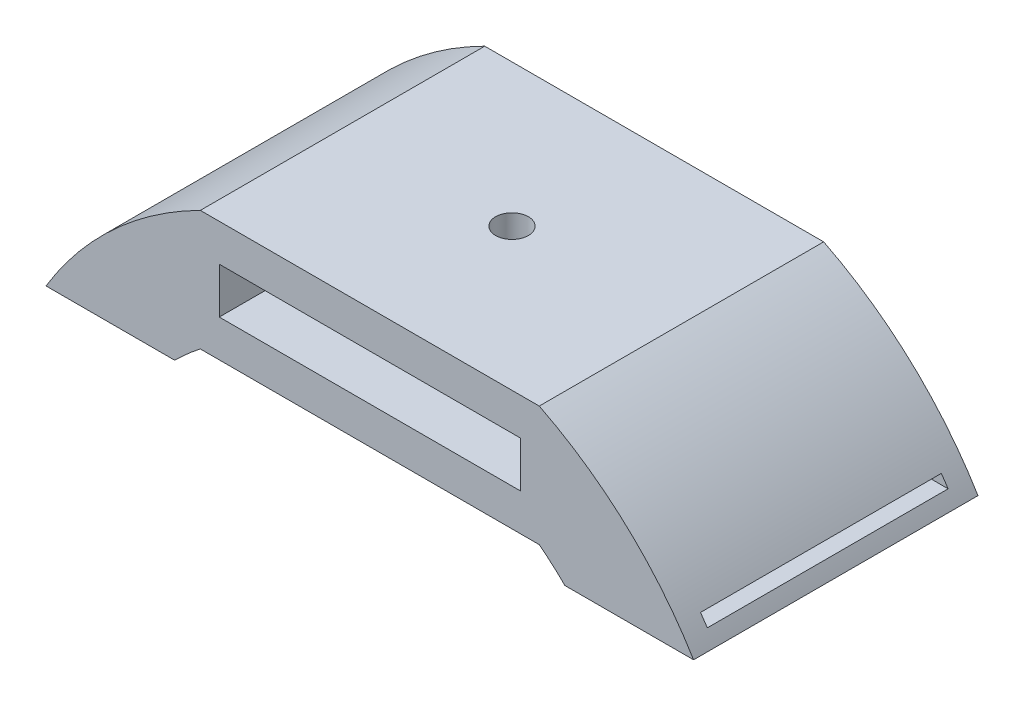
ISO-10303-21;
HEADER;
FILE_DESCRIPTION(('STEP AP214'),'2;1');
FILE_NAME('part.step','',(''),(''),'','','');
FILE_SCHEMA(('AUTOMOTIVE_DESIGN { 1 0 10303 214 1 1 1 1 }'));
ENDSEC;
DATA;
#1=APPLICATION_CONTEXT('core data for automotive mechanical design processes');
#2=APPLICATION_PROTOCOL_DEFINITION('international standard','automotive_design',2000,#1);
#3=PRODUCT_CONTEXT('',#1,'mechanical');
#4=PRODUCT('Part','Part','',(#3));
#5=PRODUCT_RELATED_PRODUCT_CATEGORY('part','',(#4));
#6=PRODUCT_DEFINITION_FORMATION('','',#4);
#7=PRODUCT_DEFINITION_CONTEXT('part definition',#1,'design');
#8=PRODUCT_DEFINITION('design','',#6,#7);
#9=PRODUCT_DEFINITION_SHAPE('','',#8);
#10=(LENGTH_UNIT() NAMED_UNIT(*) SI_UNIT(.MILLI.,.METRE.));
#11=(NAMED_UNIT(*) PLANE_ANGLE_UNIT() SI_UNIT($,.RADIAN.));
#12=(NAMED_UNIT(*) SI_UNIT($,.STERADIAN.) SOLID_ANGLE_UNIT());
#13=UNCERTAINTY_MEASURE_WITH_UNIT(LENGTH_MEASURE(1.E-05),#10,'distance_accuracy_value','');
#14=(GEOMETRIC_REPRESENTATION_CONTEXT(3) GLOBAL_UNCERTAINTY_ASSIGNED_CONTEXT((#13)) GLOBAL_UNIT_ASSIGNED_CONTEXT((#10,
#11,#12)) REPRESENTATION_CONTEXT('',''));
#15=CARTESIAN_POINT('',(0.,0.,0.));
#16=DIRECTION('',(0.,0.,1.));
#17=DIRECTION('',(1.,0.,0.));
#18=AXIS2_PLACEMENT_3D('',#15,#16,#17);
#19=CARTESIAN_POINT('',(-0.591296928327652,-3.83,-7.63139931740615));
#20=DIRECTION('',(0.,1.,0.));
#21=DIRECTION('',(0.,0.,1.));
#22=AXIS2_PLACEMENT_3D('',#19,#20,#21);
#23=CYLINDRICAL_SURFACE('',#22,1.725);
#24=CARTESIAN_POINT('',(-0.591296928327652,0.0849999999999974,-7.63139931740615));
#25=DIRECTION('',(0.,-1.,0.));
#26=DIRECTION('',(1.,0.,0.));
#27=AXIS2_PLACEMENT_3D('',#24,#25,#26);
#28=CIRCLE('',#27,1.725);
#29=CARTESIAN_POINT('',(1.13370307167235,0.0849999999999971,-7.63139931740615));
#30=VERTEX_POINT('',#29);
#31=EDGE_CURVE('E328',#30,#30,#28,.F.);
#32=ORIENTED_EDGE('',*,*,#31,.T.);
#33=EDGE_LOOP('',(#32));
#34=FACE_BOUND('',#33,.T.);
#35=CARTESIAN_POINT('',(-0.591296928327652,-0.83,-7.63139931740615));
#36=DIRECTION('',(0.,-1.,0.));
#37=DIRECTION('',(0.,0.,-1.));
#38=AXIS2_PLACEMENT_3D('',#35,#36,#37);
#39=CIRCLE('',#38,1.725);
#40=CARTESIAN_POINT('',(-0.591296928327652,-0.83,-9.35639931740615));
#41=VERTEX_POINT('',#40);
#42=EDGE_CURVE('E47',#41,#41,#39,.F.);
#43=ORIENTED_EDGE('',*,*,#42,.F.);
#44=EDGE_LOOP('',(#43));
#45=FACE_BOUND('',#44,.T.);
#46=ADVANCED_FACE('F44',(#34,#45),#23,.F.);
#47=CARTESIAN_POINT('',(0.,-3.83,0.));
#48=DIRECTION('',(0.,1.,0.));
#49=DIRECTION('',(0.,0.,1.));
#50=AXIS2_PLACEMENT_3D('',#47,#48,#49);
#51=PLANE('',#50);
#52=DIRECTION('',(0.,0.,-1.));
#53=VECTOR('',#52,1.);
#54=CARTESIAN_POINT('',(17.2837030716723,-3.83,-22.6313993174061));
#55=LINE('',#54,#53);
#56=CARTESIAN_POINT('',(17.2837030716723,-3.83,-20.3313993174061));
#57=VERTEX_POINT('',#56);
#58=CARTESIAN_POINT('',(17.2837030716723,-3.83,-22.6313993174061));
#59=VERTEX_POINT('',#58);
#60=EDGE_CURVE('E352',#57,#59,#55,.T.);
#61=ORIENTED_EDGE('',*,*,#60,.F.);
#62=DIRECTION('',(-1.,0.,0.));
#63=VECTOR('',#62,1.);
#64=CARTESIAN_POINT('',(0.,-3.83,-20.3313993174061));
#65=LINE('',#64,#63);
#66=CARTESIAN_POINT('',(-18.4662969283277,-3.83,-20.3313993174061));
#67=VERTEX_POINT('',#66);
#68=EDGE_CURVE('E416',#57,#67,#65,.T.);
#69=ORIENTED_EDGE('',*,*,#68,.T.);
#70=DIRECTION('',(0.,0.,1.));
#71=VECTOR('',#70,1.);
#72=CARTESIAN_POINT('',(-18.4662969283277,-3.83,-22.6313993174061));
#73=LINE('',#72,#71);
#74=CARTESIAN_POINT('',(-18.4662969283277,-3.83,-22.6313993174061));
#75=VERTEX_POINT('',#74);
#76=EDGE_CURVE('E345',#75,#67,#73,.T.);
#77=ORIENTED_EDGE('',*,*,#76,.F.);
#78=DIRECTION('',(-1.,0.,0.));
#79=VECTOR('',#78,1.);
#80=CARTESIAN_POINT('',(-18.4662969283277,-3.83,-22.6313993174061));
#81=LINE('',#80,#79);
#82=EDGE_CURVE('E357',#59,#75,#81,.T.);
#83=ORIENTED_EDGE('',*,*,#82,.F.);
#84=EDGE_LOOP('',(#61,#69,#77,#83));
#85=FACE_BOUND('',#84,.T.);
#86=ADVANCED_FACE('F446',(#85),#51,.F.);
#87=CARTESIAN_POINT('',(-18.4662969283277,-3.83,-22.6313993174061));
#88=DIRECTION('',(0.,0.,-1.));
#89=DIRECTION('',(-1.,0.,0.));
#90=AXIS2_PLACEMENT_3D('',#87,#88,#89);
#91=PLANE('',#90);
#92=DIRECTION('',(0.,1.,0.));
#93=VECTOR('',#92,1.);
#94=CARTESIAN_POINT('',(-16.4662969283277,4.915,-22.6313993174061));
#95=LINE('',#94,#93);
#96=CARTESIAN_POINT('',(-16.4662969283277,0.0850000000000004,-22.6313993174061));
#97=VERTEX_POINT('',#96);
#98=CARTESIAN_POINT('',(-16.4662969283277,4.915,-22.6313993174061));
#99=VERTEX_POINT('',#98);
#100=EDGE_CURVE('E248',#97,#99,#95,.T.);
#101=ORIENTED_EDGE('',*,*,#100,.F.);
#102=DIRECTION('',(-1.,0.,0.));
#103=VECTOR('',#102,1.);
#104=CARTESIAN_POINT('',(-16.4662969283277,0.0850000000000004,-22.6313993174061));
#105=LINE('',#104,#103);
#106=CARTESIAN_POINT('',(15.2837030716723,0.0849999999999948,-22.6313993174061));
#107=VERTEX_POINT('',#106);
#108=EDGE_CURVE('E281',#107,#97,#105,.T.);
#109=ORIENTED_EDGE('',*,*,#108,.F.);
#110=DIRECTION('',(0.,-1.,0.));
#111=VECTOR('',#110,1.);
#112=CARTESIAN_POINT('',(15.2837030716723,4.915,-22.6313993174061));
#113=LINE('',#112,#111);
#114=CARTESIAN_POINT('',(15.2837030716723,4.915,-22.6313993174061));
#115=VERTEX_POINT('',#114);
#116=EDGE_CURVE('E301',#115,#107,#113,.T.);
#117=ORIENTED_EDGE('',*,*,#116,.F.);
#118=DIRECTION('',(1.,0.,0.));
#119=VECTOR('',#118,1.);
#120=CARTESIAN_POINT('',(-16.4662969283277,4.915,-22.6313993174061));
#121=LINE('',#120,#119);
#122=EDGE_CURVE('E296',#99,#115,#121,.T.);
#123=ORIENTED_EDGE('',*,*,#122,.F.);
#124=EDGE_LOOP('',(#101,#109,#117,#123));
#125=FACE_BOUND('',#124,.T.);
#126=ORIENTED_EDGE('',*,*,#82,.T.);
#127=CARTESIAN_POINT('',(-0.591296928327649,-26.8432761578094,-22.6313993174061));
#128=DIRECTION('',(0.,0.,1.));
#129=DIRECTION('',(1.,0.,0.));
#130=AXIS2_PLACEMENT_3D('',#127,#128,#129);
#131=CIRCLE('',#130,29.1397752996758);
#132=CARTESIAN_POINT('',(-21.1703004662535,-6.21244685063822,-22.6313993174061));
#133=VERTEX_POINT('',#132);
#134=EDGE_CURVE('E267',#75,#133,#131,.T.);
#135=ORIENTED_EDGE('',*,*,#134,.T.);
#136=DIRECTION('',(-1.,0.,0.));
#137=VECTOR('',#136,1.);
#138=CARTESIAN_POINT('',(-21.1703004662535,-6.21244685063822,-22.6313993174061));
#139=LINE('',#138,#137);
#140=CARTESIAN_POINT('',(-34.7448785696387,-6.21244685063822,-22.6313993174061));
#141=VERTEX_POINT('',#140);
#142=EDGE_CURVE('E272',#133,#141,#139,.T.);
#143=ORIENTED_EDGE('',*,*,#142,.T.);
#144=CARTESIAN_POINT('',(-0.591296928327649,-26.8432761578094,-22.6313993174061));
#145=DIRECTION('',(0.,0.,1.));
#146=DIRECTION('',(1.,0.,0.));
#147=AXIS2_PLACEMENT_3D('',#144,#145,#146);
#148=CIRCLE('',#147,39.9011059600023);
#149=CARTESIAN_POINT('',(-18.4662969283277,8.83,-22.6313993174061));
#150=VERTEX_POINT('',#149);
#151=EDGE_CURVE('E227',#150,#141,#148,.T.);
#152=ORIENTED_EDGE('',*,*,#151,.F.);
#153=DIRECTION('',(-1.,0.,0.));
#154=VECTOR('',#153,1.);
#155=CARTESIAN_POINT('',(-18.4662969283277,8.83,-22.6313993174061));
#156=LINE('',#155,#154);
#157=CARTESIAN_POINT('',(17.2837030716723,8.83,-22.6313993174061));
#158=VERTEX_POINT('',#157);
#159=EDGE_CURVE('E339',#158,#150,#156,.T.);
#160=ORIENTED_EDGE('',*,*,#159,.F.);
#161=CARTESIAN_POINT('',(-0.591296928327649,-26.8432761578094,-22.6313993174061));
#162=DIRECTION('',(0.,0.,1.));
#163=DIRECTION('',(1.,0.,0.));
#164=AXIS2_PLACEMENT_3D('',#161,#162,#163);
#165=CIRCLE('',#164,39.9011059600023);
#166=CARTESIAN_POINT('',(33.5622847129834,-6.21244685063822,-22.6313993174061));
#167=VERTEX_POINT('',#166);
#168=EDGE_CURVE('E226',#167,#158,#165,.T.);
#169=ORIENTED_EDGE('',*,*,#168,.F.);
#170=DIRECTION('',(-1.,0.,0.));
#171=VECTOR('',#170,1.);
#172=CARTESIAN_POINT('',(33.5622847129834,-6.21244685063822,-22.6313993174061));
#173=LINE('',#172,#171);
#174=CARTESIAN_POINT('',(19.9877066095982,-6.21244685063821,-22.6313993174061));
#175=VERTEX_POINT('',#174);
#176=EDGE_CURVE('E222',#167,#175,#173,.T.);
#177=ORIENTED_EDGE('',*,*,#176,.T.);
#178=CARTESIAN_POINT('',(-0.591296928327649,-26.8432761578094,-22.6313993174061));
#179=DIRECTION('',(0.,0.,1.));
#180=DIRECTION('',(1.,0.,0.));
#181=AXIS2_PLACEMENT_3D('',#178,#179,#180);
#182=CIRCLE('',#181,29.1397752996758);
#183=EDGE_CURVE('E223',#175,#59,#182,.T.);
#184=ORIENTED_EDGE('',*,*,#183,.T.);
#185=EDGE_LOOP('',(#126,#135,#143,#152,#160,#169,#177,#184));
#186=FACE_BOUND('',#185,.T.);
#187=ADVANCED_FACE('F454',(#125,#186),#91,.T.);
#188=CARTESIAN_POINT('',(-18.4662969283276,-3.83,7.36860068259386));
#189=DIRECTION('',(0.,0.,1.));
#190=DIRECTION('',(1.,0.,0.));
#191=AXIS2_PLACEMENT_3D('',#188,#189,#190);
#192=PLANE('',#191);
#193=DIRECTION('',(0.,1.,0.));
#194=VECTOR('',#193,1.);
#195=CARTESIAN_POINT('',(-16.4662969283277,4.915,7.36860068259386));
#196=LINE('',#195,#194);
#197=CARTESIAN_POINT('',(-16.4662969283277,0.0850000000000004,7.36860068259386));
#198=VERTEX_POINT('',#197);
#199=CARTESIAN_POINT('',(-16.4662969283277,4.915,7.36860068259386));
#200=VERTEX_POINT('',#199);
#201=EDGE_CURVE('E278',#198,#200,#196,.T.);
#202=ORIENTED_EDGE('',*,*,#201,.T.);
#203=DIRECTION('',(1.,0.,0.));
#204=VECTOR('',#203,1.);
#205=CARTESIAN_POINT('',(-16.4662969283277,4.915,7.36860068259386));
#206=LINE('',#205,#204);
#207=CARTESIAN_POINT('',(15.2837030716723,4.915,7.36860068259385));
#208=VERTEX_POINT('',#207);
#209=EDGE_CURVE('E284',#200,#208,#206,.T.);
#210=ORIENTED_EDGE('',*,*,#209,.T.);
#211=DIRECTION('',(0.,-1.,0.));
#212=VECTOR('',#211,1.);
#213=CARTESIAN_POINT('',(15.2837030716723,4.915,7.36860068259386));
#214=LINE('',#213,#212);
#215=CARTESIAN_POINT('',(15.2837030716723,0.0849999999999948,7.36860068259386));
#216=VERTEX_POINT('',#215);
#217=EDGE_CURVE('E286',#208,#216,#214,.T.);
#218=ORIENTED_EDGE('',*,*,#217,.T.);
#219=DIRECTION('',(-1.,0.,0.));
#220=VECTOR('',#219,1.);
#221=CARTESIAN_POINT('',(-16.4662969283277,0.0850000000000004,7.36860068259386));
#222=LINE('',#221,#220);
#223=EDGE_CURVE('E291',#216,#198,#222,.T.);
#224=ORIENTED_EDGE('',*,*,#223,.T.);
#225=EDGE_LOOP('',(#202,#210,#218,#224));
#226=FACE_BOUND('',#225,.T.);
#227=DIRECTION('',(1.,0.,0.));
#228=VECTOR('',#227,1.);
#229=CARTESIAN_POINT('',(-18.4662969283276,-3.83,7.36860068259386));
#230=LINE('',#229,#228);
#231=CARTESIAN_POINT('',(-18.4662969283276,-3.83,7.36860068259386));
#232=VERTEX_POINT('',#231);
#233=CARTESIAN_POINT('',(17.2837030716723,-3.83,7.36860068259385));
#234=VERTEX_POINT('',#233);
#235=EDGE_CURVE('E350',#232,#234,#230,.T.);
#236=ORIENTED_EDGE('',*,*,#235,.T.);
#237=CARTESIAN_POINT('',(-0.591296928327649,-26.8432761578094,7.36860068259386));
#238=DIRECTION('',(0.,0.,1.));
#239=DIRECTION('',(1.,0.,0.));
#240=AXIS2_PLACEMENT_3D('',#237,#238,#239);
#241=CIRCLE('',#240,29.1397752996758);
#242=CARTESIAN_POINT('',(19.9877066095982,-6.21244685063821,7.36860068259386));
#243=VERTEX_POINT('',#242);
#244=EDGE_CURVE('E236',#243,#234,#241,.T.);
#245=ORIENTED_EDGE('',*,*,#244,.F.);
#246=DIRECTION('',(-1.,0.,0.));
#247=VECTOR('',#246,1.);
#248=CARTESIAN_POINT('',(33.5622847129834,-6.21244685063822,7.36860068259386));
#249=LINE('',#248,#247);
#250=CARTESIAN_POINT('',(33.5622847129834,-6.21244685063822,7.36860068259386));
#251=VERTEX_POINT('',#250);
#252=EDGE_CURVE('E231',#251,#243,#249,.T.);
#253=ORIENTED_EDGE('',*,*,#252,.F.);
#254=CARTESIAN_POINT('',(-0.591296928327649,-26.8432761578094,7.36860068259386));
#255=DIRECTION('',(0.,0.,1.));
#256=DIRECTION('',(1.,0.,0.));
#257=AXIS2_PLACEMENT_3D('',#254,#255,#256);
#258=CIRCLE('',#257,39.9011059600023);
#259=CARTESIAN_POINT('',(17.2837030716723,8.83,7.36860068259385));
#260=VERTEX_POINT('',#259);
#261=EDGE_CURVE('E245',#251,#260,#258,.T.);
#262=ORIENTED_EDGE('',*,*,#261,.T.);
#263=DIRECTION('',(1.,0.,0.));
#264=VECTOR('',#263,1.);
#265=CARTESIAN_POINT('',(-18.4662969283276,8.83,7.36860068259386));
#266=LINE('',#265,#264);
#267=CARTESIAN_POINT('',(-18.4662969283276,8.83,7.36860068259386));
#268=VERTEX_POINT('',#267);
#269=EDGE_CURVE('E334',#268,#260,#266,.T.);
#270=ORIENTED_EDGE('',*,*,#269,.F.);
#271=CARTESIAN_POINT('',(-0.591296928327649,-26.8432761578094,7.36860068259386));
#272=DIRECTION('',(0.,0.,1.));
#273=DIRECTION('',(1.,0.,0.));
#274=AXIS2_PLACEMENT_3D('',#271,#272,#273);
#275=CIRCLE('',#274,39.9011059600023);
#276=CARTESIAN_POINT('',(-34.7448785696387,-6.21244685063822,7.36860068259386));
#277=VERTEX_POINT('',#276);
#278=EDGE_CURVE('E266',#268,#277,#275,.T.);
#279=ORIENTED_EDGE('',*,*,#278,.T.);
#280=DIRECTION('',(-1.,0.,0.));
#281=VECTOR('',#280,1.);
#282=CARTESIAN_POINT('',(-21.1703004662535,-6.21244685063822,7.36860068259386));
#283=LINE('',#282,#281);
#284=CARTESIAN_POINT('',(-21.1703004662535,-6.21244685063822,7.36860068259386));
#285=VERTEX_POINT('',#284);
#286=EDGE_CURVE('E265',#285,#277,#283,.T.);
#287=ORIENTED_EDGE('',*,*,#286,.F.);
#288=CARTESIAN_POINT('',(-0.591296928327649,-26.8432761578094,7.36860068259386));
#289=DIRECTION('',(0.,0.,1.));
#290=DIRECTION('',(1.,0.,0.));
#291=AXIS2_PLACEMENT_3D('',#288,#289,#290);
#292=CIRCLE('',#291,29.1397752996758);
#293=EDGE_CURVE('E256',#232,#285,#292,.T.);
#294=ORIENTED_EDGE('',*,*,#293,.F.);
#295=EDGE_LOOP('',(#236,#245,#253,#262,#270,#279,#287,#294));
#296=FACE_BOUND('',#295,.T.);
#297=ADVANCED_FACE('F50',(#226,#296),#192,.T.);
#298=CARTESIAN_POINT('',(-18.4662969283277,-3.83,5.06860068259386));
#299=VERTEX_POINT('',#298);
#300=EDGE_CURVE('E344',#299,#232,#73,.T.);
#301=ORIENTED_EDGE('',*,*,#300,.F.);
#302=DIRECTION('',(1.,0.,0.));
#303=VECTOR('',#302,1.);
#304=CARTESIAN_POINT('',(0.,-3.83,5.06860068259386));
#305=LINE('',#304,#303);
#306=CARTESIAN_POINT('',(17.2837030716723,-3.83,5.06860068259386));
#307=VERTEX_POINT('',#306);
#308=EDGE_CURVE('E195',#299,#307,#305,.T.);
#309=ORIENTED_EDGE('',*,*,#308,.T.);
#310=EDGE_CURVE('E355',#234,#307,#55,.T.);
#311=ORIENTED_EDGE('',*,*,#310,.F.);
#312=ORIENTED_EDGE('',*,*,#235,.F.);
#313=EDGE_LOOP('',(#301,#309,#311,#312));
#314=FACE_BOUND('',#313,.T.);
#315=ADVANCED_FACE('F433',(#314),#51,.F.);
#316=CARTESIAN_POINT('',(-0.591296928327652,4.915,-7.63139931740615));
#317=DIRECTION('',(0.,1.,0.));
#318=DIRECTION('',(-1.,0.,0.));
#319=AXIS2_PLACEMENT_3D('',#316,#317,#318);
#320=CIRCLE('',#319,1.725);
#321=CARTESIAN_POINT('',(-2.31629692832765,4.915,-7.63139931740615));
#322=VERTEX_POINT('',#321);
#323=EDGE_CURVE('E314',#322,#322,#320,.F.);
#324=ORIENTED_EDGE('',*,*,#323,.T.);
#325=EDGE_LOOP('',(#324));
#326=FACE_BOUND('',#325,.T.);
#327=CARTESIAN_POINT('',(-0.591296928327652,8.83,-7.63139931740615));
#328=DIRECTION('',(0.,1.,0.));
#329=DIRECTION('',(0.,0.,1.));
#330=AXIS2_PLACEMENT_3D('',#327,#328,#329);
#331=CIRCLE('',#330,1.725);
#332=CARTESIAN_POINT('',(-0.591296928327652,8.83,-5.90639931740615));
#333=VERTEX_POINT('',#332);
#334=EDGE_CURVE('E322',#333,#333,#331,.T.);
#335=ORIENTED_EDGE('',*,*,#334,.T.);
#336=EDGE_LOOP('',(#335));
#337=FACE_BOUND('',#336,.T.);
#338=ADVANCED_FACE('F490',(#326,#337),#23,.F.);
#339=CARTESIAN_POINT('',(0.,8.83,0.));
#340=DIRECTION('',(0.,1.,0.));
#341=DIRECTION('',(0.,0.,1.));
#342=AXIS2_PLACEMENT_3D('',#339,#340,#341);
#343=PLANE('',#342);
#344=DIRECTION('',(0.,0.,1.));
#345=VECTOR('',#344,1.);
#346=CARTESIAN_POINT('',(-18.4662969283277,8.83,-22.6313993174061));
#347=LINE('',#346,#345);
#348=EDGE_CURVE('E327',#150,#268,#347,.T.);
#349=ORIENTED_EDGE('',*,*,#348,.T.);
#350=ORIENTED_EDGE('',*,*,#269,.T.);
#351=DIRECTION('',(0.,0.,-1.));
#352=VECTOR('',#351,1.);
#353=CARTESIAN_POINT('',(17.2837030716723,8.83,-22.6313993174061));
#354=LINE('',#353,#352);
#355=EDGE_CURVE('E337',#260,#158,#354,.T.);
#356=ORIENTED_EDGE('',*,*,#355,.T.);
#357=ORIENTED_EDGE('',*,*,#159,.T.);
#358=EDGE_LOOP('',(#349,#350,#356,#357));
#359=FACE_BOUND('',#358,.T.);
#360=ORIENTED_EDGE('',*,*,#334,.F.);
#361=EDGE_LOOP('',(#360));
#362=FACE_BOUND('',#361,.T.);
#363=ADVANCED_FACE('F462',(#359,#362),#343,.T.);
#364=CARTESIAN_POINT('',(-16.4662969283277,0.0850000000000004,7.36860068259386));
#365=DIRECTION('',(0.,-1.,0.));
#366=DIRECTION('',(1.,0.,0.));
#367=AXIS2_PLACEMENT_3D('',#364,#365,#366);
#368=PLANE('',#367);
#369=ORIENTED_EDGE('',*,*,#108,.T.);
#370=DIRECTION('',(0.,0.,-1.));
#371=VECTOR('',#370,1.);
#372=CARTESIAN_POINT('',(-16.4662969283277,0.0850000000000004,7.36860068259386));
#373=LINE('',#372,#371);
#374=EDGE_CURVE('E313',#198,#97,#373,.T.);
#375=ORIENTED_EDGE('',*,*,#374,.F.);
#376=ORIENTED_EDGE('',*,*,#223,.F.);
#377=DIRECTION('',(0.,0.,-1.));
#378=VECTOR('',#377,1.);
#379=CARTESIAN_POINT('',(15.2837030716723,0.0849999999999948,7.36860068259386));
#380=LINE('',#379,#378);
#381=EDGE_CURVE('E312',#216,#107,#380,.T.);
#382=ORIENTED_EDGE('',*,*,#381,.T.);
#383=EDGE_LOOP('',(#369,#375,#376,#382));
#384=FACE_BOUND('',#383,.T.);
#385=ORIENTED_EDGE('',*,*,#31,.F.);
#386=EDGE_LOOP('',(#385));
#387=FACE_BOUND('',#386,.T.);
#388=ADVANCED_FACE('F502',(#384,#387),#368,.F.);
#389=CARTESIAN_POINT('',(-16.4662969283277,4.915,7.36860068259386));
#390=DIRECTION('',(0.,1.,0.));
#391=DIRECTION('',(-1.,0.,0.));
#392=AXIS2_PLACEMENT_3D('',#389,#390,#391);
#393=PLANE('',#392);
#394=ORIENTED_EDGE('',*,*,#122,.T.);
#395=DIRECTION('',(0.,0.,-1.));
#396=VECTOR('',#395,1.);
#397=CARTESIAN_POINT('',(15.2837030716723,4.915,7.36860068259386));
#398=LINE('',#397,#396);
#399=EDGE_CURVE('E318',#208,#115,#398,.T.);
#400=ORIENTED_EDGE('',*,*,#399,.F.);
#401=ORIENTED_EDGE('',*,*,#209,.F.);
#402=DIRECTION('',(0.,0.,-1.));
#403=VECTOR('',#402,1.);
#404=CARTESIAN_POINT('',(-16.4662969283277,4.915,7.36860068259386));
#405=LINE('',#404,#403);
#406=EDGE_CURVE('E300',#200,#99,#405,.T.);
#407=ORIENTED_EDGE('',*,*,#406,.T.);
#408=EDGE_LOOP('',(#394,#400,#401,#407));
#409=FACE_BOUND('',#408,.T.);
#410=ORIENTED_EDGE('',*,*,#323,.F.);
#411=EDGE_LOOP('',(#410));
#412=FACE_BOUND('',#411,.T.);
#413=ADVANCED_FACE('F509',(#409,#412),#393,.F.);
#414=CARTESIAN_POINT('',(-16.4662969283277,4.915,7.36860068259386));
#415=DIRECTION('',(-1.,0.,0.));
#416=DIRECTION('',(0.,0.,1.));
#417=AXIS2_PLACEMENT_3D('',#414,#415,#416);
#418=PLANE('',#417);
#419=ORIENTED_EDGE('',*,*,#100,.T.);
#420=ORIENTED_EDGE('',*,*,#406,.F.);
#421=ORIENTED_EDGE('',*,*,#201,.F.);
#422=ORIENTED_EDGE('',*,*,#374,.T.);
#423=EDGE_LOOP('',(#419,#420,#421,#422));
#424=FACE_BOUND('',#423,.T.);
#425=ADVANCED_FACE('F506',(#424),#418,.F.);
#426=CARTESIAN_POINT('',(15.2837030716723,4.915,7.36860068259386));
#427=DIRECTION('',(1.,0.,0.));
#428=DIRECTION('',(0.,0.,-1.));
#429=AXIS2_PLACEMENT_3D('',#426,#427,#428);
#430=PLANE('',#429);
#431=ORIENTED_EDGE('',*,*,#116,.T.);
#432=ORIENTED_EDGE('',*,*,#381,.F.);
#433=ORIENTED_EDGE('',*,*,#217,.F.);
#434=ORIENTED_EDGE('',*,*,#399,.T.);
#435=EDGE_LOOP('',(#431,#432,#433,#434));
#436=FACE_BOUND('',#435,.T.);
#437=ADVANCED_FACE('F513',(#436),#430,.F.);
#438=CARTESIAN_POINT('',(33.5622847129834,-6.21244685063822,7.36860068259386));
#439=DIRECTION('',(0.,-1.,0.));
#440=DIRECTION('',(1.,0.,0.));
#441=AXIS2_PLACEMENT_3D('',#438,#439,#440);
#442=PLANE('',#441);
#443=DIRECTION('',(0.,0.,-1.));
#444=VECTOR('',#443,1.);
#445=CARTESIAN_POINT('',(19.9877066095982,-6.21244685063821,7.36860068259386));
#446=LINE('',#445,#444);
#447=EDGE_CURVE('E247',#243,#175,#446,.T.);
#448=ORIENTED_EDGE('',*,*,#447,.T.);
#449=ORIENTED_EDGE('',*,*,#176,.F.);
#450=DIRECTION('',(0.,0.,-1.));
#451=VECTOR('',#450,1.);
#452=CARTESIAN_POINT('',(33.5622847129834,-6.21244685063822,7.36860068259386));
#453=LINE('',#452,#451);
#454=EDGE_CURVE('E249',#251,#167,#453,.T.);
#455=ORIENTED_EDGE('',*,*,#454,.F.);
#456=ORIENTED_EDGE('',*,*,#252,.T.);
#457=EDGE_LOOP('',(#448,#449,#455,#456));
#458=FACE_BOUND('',#457,.T.);
#459=ADVANCED_FACE('F460',(#458),#442,.T.);
#460=CARTESIAN_POINT('',(-0.591296928327649,-26.8432761578094,7.36860068259386));
#461=DIRECTION('',(0.,0.,-1.));
#462=DIRECTION('',(-1.,0.,0.));
#463=AXIS2_PLACEMENT_3D('',#460,#461,#462);
#464=CYLINDRICAL_SURFACE('',#463,39.9011059600023);
#465=DIRECTION('',(0.,0.,-1.));
#466=VECTOR('',#465,1.);
#467=CARTESIAN_POINT('',(31.99437304142,-3.8156325646404,7.36860068259386));
#468=LINE('',#467,#466);
#469=CARTESIAN_POINT('',(31.99437304142,-3.8156325646404,5.06860068259386));
#470=VERTEX_POINT('',#469);
#471=CARTESIAN_POINT('',(31.99437304142,-3.8156325646404,-20.3313993174061));
#472=VERTEX_POINT('',#471);
#473=EDGE_CURVE('E207',#470,#472,#468,.T.);
#474=ORIENTED_EDGE('',*,*,#473,.T.);
#475=CARTESIAN_POINT('',(-0.591296928327649,-26.8432761578094,-20.3313993174061));
#476=DIRECTION('',(0.,0.,-1.));
#477=DIRECTION('',(-1.,0.,0.));
#478=AXIS2_PLACEMENT_3D('',#475,#476,#477);
#479=CIRCLE('',#478,39.9011059600023);
#480=CARTESIAN_POINT('',(32.7115774059242,-4.8656325646404,-20.3313993174061));
#481=VERTEX_POINT('',#480);
#482=EDGE_CURVE('E200',#472,#481,#479,.T.);
#483=ORIENTED_EDGE('',*,*,#482,.T.);
#484=DIRECTION('',(0.,0.,-1.));
#485=VECTOR('',#484,1.);
#486=CARTESIAN_POINT('',(32.7115774059242,-4.86563256464041,7.36860068259386));
#487=LINE('',#486,#485);
#488=CARTESIAN_POINT('',(32.7115774059242,-4.86563256464041,5.06860068259386));
#489=VERTEX_POINT('',#488);
#490=EDGE_CURVE('E184',#481,#489,#487,.F.);
#491=ORIENTED_EDGE('',*,*,#490,.T.);
#492=CARTESIAN_POINT('',(-0.591296928327649,-26.8432761578094,5.06860068259386));
#493=DIRECTION('',(0.,0.,1.));
#494=DIRECTION('',(1.,0.,0.));
#495=AXIS2_PLACEMENT_3D('',#492,#493,#494);
#496=CIRCLE('',#495,39.9011059600023);
#497=EDGE_CURVE('E413',#489,#470,#496,.T.);
#498=ORIENTED_EDGE('',*,*,#497,.T.);
#499=EDGE_LOOP('',(#474,#483,#491,#498));
#500=FACE_BOUND('',#499,.T.);
#501=ORIENTED_EDGE('',*,*,#454,.T.);
#502=ORIENTED_EDGE('',*,*,#168,.T.);
#503=ORIENTED_EDGE('',*,*,#355,.F.);
#504=ORIENTED_EDGE('',*,*,#261,.F.);
#505=EDGE_LOOP('',(#501,#502,#503,#504));
#506=FACE_BOUND('',#505,.T.);
#507=ADVANCED_FACE('F210',(#500,#506),#464,.T.);
#508=CARTESIAN_POINT('',(-0.591296928327649,-26.8432761578094,7.36860068259386));
#509=DIRECTION('',(0.,0.,-1.));
#510=DIRECTION('',(-1.,0.,0.));
#511=AXIS2_PLACEMENT_3D('',#508,#509,#510);
#512=CYLINDRICAL_SURFACE('',#511,29.1397752996758);
#513=CARTESIAN_POINT('',(-0.591296928327649,-26.8432761578094,-20.3313993174061));
#514=DIRECTION('',(0.,0.,-1.));
#515=DIRECTION('',(-1.,0.,0.));
#516=AXIS2_PLACEMENT_3D('',#513,#514,#515);
#517=CIRCLE('',#516,29.1397752996758);
#518=CARTESIAN_POINT('',(18.5426960320358,-4.8656325646404,-20.3313993174061));
#519=VERTEX_POINT('',#518);
#520=EDGE_CURVE('E205',#57,#519,#517,.T.);
#521=ORIENTED_EDGE('',*,*,#520,.F.);
#522=ORIENTED_EDGE('',*,*,#60,.T.);
#523=ORIENTED_EDGE('',*,*,#183,.F.);
#524=ORIENTED_EDGE('',*,*,#447,.F.);
#525=ORIENTED_EDGE('',*,*,#244,.T.);
#526=ORIENTED_EDGE('',*,*,#310,.T.);
#527=CARTESIAN_POINT('',(-0.591296928327649,-26.8432761578094,5.06860068259386));
#528=DIRECTION('',(0.,0.,1.));
#529=DIRECTION('',(1.,0.,0.));
#530=AXIS2_PLACEMENT_3D('',#527,#528,#529);
#531=CIRCLE('',#530,29.1397752996758);
#532=CARTESIAN_POINT('',(18.5426960320358,-4.8656325646404,5.06860068259386));
#533=VERTEX_POINT('',#532);
#534=EDGE_CURVE('E408',#533,#307,#531,.T.);
#535=ORIENTED_EDGE('',*,*,#534,.F.);
#536=DIRECTION('',(0.,0.,-1.));
#537=VECTOR('',#536,1.);
#538=CARTESIAN_POINT('',(18.5426960320357,-4.86563256464041,7.36860068259386));
#539=LINE('',#538,#537);
#540=EDGE_CURVE('E191',#519,#533,#539,.F.);
#541=ORIENTED_EDGE('',*,*,#540,.F.);
#542=EDGE_LOOP('',(#521,#522,#523,#524,#525,#526,#535,#541));
#543=FACE_BOUND('',#542,.T.);
#544=ADVANCED_FACE('F428',(#543),#512,.F.);
#545=CARTESIAN_POINT('',(-0.591296928327649,-26.8432761578094,7.36860068259386));
#546=DIRECTION('',(0.,0.,-1.));
#547=DIRECTION('',(-1.,0.,0.));
#548=AXIS2_PLACEMENT_3D('',#545,#546,#547);
#549=CYLINDRICAL_SURFACE('',#548,39.9011059600023);
#550=DIRECTION('',(0.,0.,-1.));
#551=VECTOR('',#550,1.);
#552=CARTESIAN_POINT('',(-33.8941712625795,-4.86563256464041,7.36860068259386));
#553=LINE('',#552,#551);
#554=CARTESIAN_POINT('',(-33.8941712625794,-4.8656325646404,5.06860068259386));
#555=VERTEX_POINT('',#554);
#556=CARTESIAN_POINT('',(-33.8941712625795,-4.86563256464041,-20.3313993174061));
#557=VERTEX_POINT('',#556);
#558=EDGE_CURVE('E392',#555,#557,#553,.T.);
#559=ORIENTED_EDGE('',*,*,#558,.T.);
#560=CARTESIAN_POINT('',(-0.591296928327649,-26.8432761578094,-20.3313993174061));
#561=DIRECTION('',(0.,0.,-1.));
#562=DIRECTION('',(-1.,0.,0.));
#563=AXIS2_PLACEMENT_3D('',#560,#561,#562);
#564=CIRCLE('',#563,39.9011059600023);
#565=CARTESIAN_POINT('',(-33.1769668980753,-3.8156325646404,-20.3313993174061));
#566=VERTEX_POINT('',#565);
#567=EDGE_CURVE('E211',#557,#566,#564,.T.);
#568=ORIENTED_EDGE('',*,*,#567,.T.);
#569=DIRECTION('',(0.,0.,-1.));
#570=VECTOR('',#569,1.);
#571=CARTESIAN_POINT('',(-33.1769668980753,-3.8156325646404,7.36860068259386));
#572=LINE('',#571,#570);
#573=CARTESIAN_POINT('',(-33.1769668980753,-3.8156325646404,5.06860068259386));
#574=VERTEX_POINT('',#573);
#575=EDGE_CURVE('E11',#566,#574,#572,.F.);
#576=ORIENTED_EDGE('',*,*,#575,.T.);
#577=CARTESIAN_POINT('',(-0.591296928327649,-26.8432761578094,5.06860068259386));
#578=DIRECTION('',(0.,0.,1.));
#579=DIRECTION('',(1.,0.,0.));
#580=AXIS2_PLACEMENT_3D('',#577,#578,#579);
#581=CIRCLE('',#580,39.9011059600023);
#582=EDGE_CURVE('E412',#574,#555,#581,.T.);
#583=ORIENTED_EDGE('',*,*,#582,.T.);
#584=EDGE_LOOP('',(#559,#568,#576,#583));
#585=FACE_BOUND('',#584,.T.);
#586=ORIENTED_EDGE('',*,*,#348,.F.);
#587=ORIENTED_EDGE('',*,*,#151,.T.);
#588=DIRECTION('',(0.,0.,-1.));
#589=VECTOR('',#588,1.);
#590=CARTESIAN_POINT('',(-34.7448785696387,-6.21244685063822,7.36860068259386));
#591=LINE('',#590,#589);
#592=EDGE_CURVE('E214',#277,#141,#591,.T.);
#593=ORIENTED_EDGE('',*,*,#592,.F.);
#594=ORIENTED_EDGE('',*,*,#278,.F.);
#595=EDGE_LOOP('',(#586,#587,#593,#594));
#596=FACE_BOUND('',#595,.T.);
#597=ADVANCED_FACE('F470',(#585,#596),#549,.T.);
#598=CARTESIAN_POINT('',(-21.1703004662535,-6.21244685063822,7.36860068259386));
#599=DIRECTION('',(0.,-1.,0.));
#600=DIRECTION('',(1.,0.,0.));
#601=AXIS2_PLACEMENT_3D('',#598,#599,#600);
#602=PLANE('',#601);
#603=ORIENTED_EDGE('',*,*,#592,.T.);
#604=ORIENTED_EDGE('',*,*,#142,.F.);
#605=DIRECTION('',(0.,0.,-1.));
#606=VECTOR('',#605,1.);
#607=CARTESIAN_POINT('',(-21.1703004662535,-6.21244685063822,7.36860068259386));
#608=LINE('',#607,#606);
#609=EDGE_CURVE('E254',#285,#133,#608,.T.);
#610=ORIENTED_EDGE('',*,*,#609,.F.);
#611=ORIENTED_EDGE('',*,*,#286,.T.);
#612=EDGE_LOOP('',(#603,#604,#610,#611));
#613=FACE_BOUND('',#612,.T.);
#614=ADVANCED_FACE('F473',(#613),#602,.T.);
#615=CARTESIAN_POINT('',(-0.591296928327649,-26.8432761578094,7.36860068259386));
#616=DIRECTION('',(0.,0.,-1.));
#617=DIRECTION('',(-1.,0.,0.));
#618=AXIS2_PLACEMENT_3D('',#615,#616,#617);
#619=CYLINDRICAL_SURFACE('',#618,29.1397752996758);
#620=CARTESIAN_POINT('',(-0.591296928327649,-26.8432761578094,-20.3313993174061));
#621=DIRECTION('',(0.,0.,-1.));
#622=DIRECTION('',(-1.,0.,0.));
#623=AXIS2_PLACEMENT_3D('',#620,#621,#622);
#624=CIRCLE('',#623,29.1397752996758);
#625=CARTESIAN_POINT('',(-19.725289888691,-4.8656325646404,-20.3313993174061));
#626=VERTEX_POINT('',#625);
#627=EDGE_CURVE('E54',#626,#67,#624,.T.);
#628=ORIENTED_EDGE('',*,*,#627,.F.);
#629=DIRECTION('',(0.,0.,-1.));
#630=VECTOR('',#629,1.);
#631=CARTESIAN_POINT('',(-19.725289888691,-4.86563256464041,7.36860068259386));
#632=LINE('',#631,#630);
#633=CARTESIAN_POINT('',(-19.725289888691,-4.86563256464041,5.06860068259386));
#634=VERTEX_POINT('',#633);
#635=EDGE_CURVE('E358',#634,#626,#632,.T.);
#636=ORIENTED_EDGE('',*,*,#635,.F.);
#637=CARTESIAN_POINT('',(-0.591296928327649,-26.8432761578094,5.06860068259386));
#638=DIRECTION('',(0.,0.,1.));
#639=DIRECTION('',(1.,0.,0.));
#640=AXIS2_PLACEMENT_3D('',#637,#638,#639);
#641=CIRCLE('',#640,29.1397752996758);
#642=EDGE_CURVE('E369',#299,#634,#641,.T.);
#643=ORIENTED_EDGE('',*,*,#642,.F.);
#644=ORIENTED_EDGE('',*,*,#300,.T.);
#645=ORIENTED_EDGE('',*,*,#293,.T.);
#646=ORIENTED_EDGE('',*,*,#609,.T.);
#647=ORIENTED_EDGE('',*,*,#134,.F.);
#648=ORIENTED_EDGE('',*,*,#76,.T.);
#649=EDGE_LOOP('',(#628,#636,#643,#644,#645,#646,#647,#648));
#650=FACE_BOUND('',#649,.T.);
#651=ADVANCED_FACE('F439',(#650),#619,.F.);
#652=CARTESIAN_POINT('',(33.5622847129834,-3.8156325646404,-20.3313993174061));
#653=DIRECTION('',(0.,1.,0.));
#654=DIRECTION('',(0.,0.,1.));
#655=AXIS2_PLACEMENT_3D('',#652,#653,#654);
#656=PLANE('',#655);
#657=CARTESIAN_POINT('',(-0.591296928327652,-3.8156325646404,-7.63139931740615));
#658=DIRECTION('',(0.,1.,0.));
#659=DIRECTION('',(0.,0.,1.));
#660=AXIS2_PLACEMENT_3D('',#657,#658,#659);
#661=CIRCLE('',#660,2.85);
#662=CARTESIAN_POINT('',(-0.591296928327652,-3.8156325646404,-4.78139931740615));
#663=VERTEX_POINT('',#662);
#664=EDGE_CURVE('E372',#663,#663,#661,.T.);
#665=ORIENTED_EDGE('',*,*,#664,.T.);
#666=EDGE_LOOP('',(#665));
#667=FACE_BOUND('',#666,.T.);
#668=DIRECTION('',(-1.,0.,0.));
#669=VECTOR('',#668,1.);
#670=CARTESIAN_POINT('',(33.5622847129834,-3.8156325646404,5.06860068259386));
#671=LINE('',#670,#669);
#672=EDGE_CURVE('E395',#470,#574,#671,.T.);
#673=ORIENTED_EDGE('',*,*,#672,.T.);
#674=ORIENTED_EDGE('',*,*,#575,.F.);
#675=DIRECTION('',(-1.,0.,0.));
#676=VECTOR('',#675,1.);
#677=CARTESIAN_POINT('',(33.5622847129834,-3.8156325646404,-20.3313993174061));
#678=LINE('',#677,#676);
#679=EDGE_CURVE('E389',#472,#566,#678,.T.);
#680=ORIENTED_EDGE('',*,*,#679,.F.);
#681=ORIENTED_EDGE('',*,*,#473,.F.);
#682=EDGE_LOOP('',(#673,#674,#680,#681));
#683=FACE_BOUND('',#682,.T.);
#684=ADVANCED_FACE('F479',(#667,#683),#656,.F.);
#685=CARTESIAN_POINT('',(33.5622847129834,-3.8156325646404,-20.3313993174061));
#686=DIRECTION('',(0.,0.,-1.));
#687=DIRECTION('',(-1.,0.,0.));
#688=AXIS2_PLACEMENT_3D('',#685,#686,#687);
#689=PLANE('',#688);
#690=ORIENTED_EDGE('',*,*,#679,.T.);
#691=ORIENTED_EDGE('',*,*,#567,.F.);
#692=DIRECTION('',(-1.,0.,0.));
#693=VECTOR('',#692,1.);
#694=CARTESIAN_POINT('',(33.5622847129834,-4.8656325646404,-20.3313993174061));
#695=LINE('',#694,#693);
#696=EDGE_CURVE('E72',#626,#557,#695,.T.);
#697=ORIENTED_EDGE('',*,*,#696,.F.);
#698=ORIENTED_EDGE('',*,*,#627,.T.);
#699=ORIENTED_EDGE('',*,*,#68,.F.);
#700=ORIENTED_EDGE('',*,*,#520,.T.);
#701=EDGE_CURVE('E190',#481,#519,#695,.T.);
#702=ORIENTED_EDGE('',*,*,#701,.F.);
#703=ORIENTED_EDGE('',*,*,#482,.F.);
#704=EDGE_LOOP('',(#690,#691,#697,#698,#699,#700,#702,#703));
#705=FACE_BOUND('',#704,.T.);
#706=ADVANCED_FACE('F196',(#705),#689,.F.);
#707=CARTESIAN_POINT('',(33.5622847129834,-3.8156325646404,5.06860068259386));
#708=DIRECTION('',(0.,0.,1.));
#709=DIRECTION('',(1.,0.,0.));
#710=AXIS2_PLACEMENT_3D('',#707,#708,#709);
#711=PLANE('',#710);
#712=DIRECTION('',(-1.,0.,0.));
#713=VECTOR('',#712,1.);
#714=CARTESIAN_POINT('',(33.5622847129834,-4.8656325646404,5.06860068259386));
#715=LINE('',#714,#713);
#716=EDGE_CURVE('E63',#489,#533,#715,.T.);
#717=ORIENTED_EDGE('',*,*,#716,.T.);
#718=ORIENTED_EDGE('',*,*,#534,.T.);
#719=ORIENTED_EDGE('',*,*,#308,.F.);
#720=ORIENTED_EDGE('',*,*,#642,.T.);
#721=EDGE_CURVE('E204',#634,#555,#715,.T.);
#722=ORIENTED_EDGE('',*,*,#721,.T.);
#723=ORIENTED_EDGE('',*,*,#582,.F.);
#724=ORIENTED_EDGE('',*,*,#672,.F.);
#725=ORIENTED_EDGE('',*,*,#497,.F.);
#726=EDGE_LOOP('',(#717,#718,#719,#720,#722,#723,#724,#725));
#727=FACE_BOUND('',#726,.T.);
#728=ADVANCED_FACE('F422',(#727),#711,.F.);
#729=CARTESIAN_POINT('',(33.5622847129834,-4.8656325646404,-20.3313993174061));
#730=DIRECTION('',(0.,-1.,0.));
#731=DIRECTION('',(0.,0.,-1.));
#732=AXIS2_PLACEMENT_3D('',#729,#730,#731);
#733=PLANE('',#732);
#734=ORIENTED_EDGE('',*,*,#701,.T.);
#735=ORIENTED_EDGE('',*,*,#540,.T.);
#736=ORIENTED_EDGE('',*,*,#716,.F.);
#737=ORIENTED_EDGE('',*,*,#490,.F.);
#738=EDGE_LOOP('',(#734,#735,#736,#737));
#739=FACE_BOUND('',#738,.T.);
#740=ADVANCED_FACE('F187',(#739),#733,.F.);
#741=ORIENTED_EDGE('',*,*,#721,.F.);
#742=ORIENTED_EDGE('',*,*,#635,.T.);
#743=ORIENTED_EDGE('',*,*,#696,.T.);
#744=ORIENTED_EDGE('',*,*,#558,.F.);
#745=EDGE_LOOP('',(#741,#742,#743,#744));
#746=FACE_BOUND('',#745,.T.);
#747=ADVANCED_FACE('F635',(#746),#733,.F.);
#748=CARTESIAN_POINT('',(-0.591296928327652,-0.83,-7.63139931740615));
#749=DIRECTION('',(0.,-1.,0.));
#750=DIRECTION('',(0.,0.,-1.));
#751=AXIS2_PLACEMENT_3D('',#748,#749,#750);
#752=PLANE('',#751);
#753=CARTESIAN_POINT('',(-0.591296928327652,-0.83,-7.63139931740615));
#754=DIRECTION('',(0.,-1.,0.));
#755=DIRECTION('',(0.,0.,-1.));
#756=AXIS2_PLACEMENT_3D('',#753,#754,#755);
#757=CIRCLE('',#756,2.85);
#758=CARTESIAN_POINT('',(-0.591296928327652,-0.83,-10.4813993174061));
#759=VERTEX_POINT('',#758);
#760=EDGE_CURVE('E380',#759,#759,#757,.T.);
#761=ORIENTED_EDGE('',*,*,#760,.T.);
#762=EDGE_LOOP('',(#761));
#763=FACE_BOUND('',#762,.T.);
#764=ORIENTED_EDGE('',*,*,#42,.T.);
#765=EDGE_LOOP('',(#764));
#766=FACE_BOUND('',#765,.T.);
#767=ADVANCED_FACE('F639',(#763,#766),#752,.T.);
#768=CARTESIAN_POINT('',(-0.591296928327652,-0.83,-7.63139931740615));
#769=DIRECTION('',(0.,-1.,0.));
#770=DIRECTION('',(0.,0.,-1.));
#771=AXIS2_PLACEMENT_3D('',#768,#769,#770);
#772=CYLINDRICAL_SURFACE('',#771,2.85);
#773=ORIENTED_EDGE('',*,*,#760,.F.);
#774=EDGE_LOOP('',(#773));
#775=FACE_BOUND('',#774,.T.);
#776=ORIENTED_EDGE('',*,*,#664,.F.);
#777=EDGE_LOOP('',(#776));
#778=FACE_BOUND('',#777,.T.);
#779=ADVANCED_FACE('F655',(#775,#778),#772,.F.);
#780=CLOSED_SHELL('',(#46,#86,#187,#297,#315,#338,#363,#388,#413,#425,#437,#459,#507,#544,#597,
#614,#651,#684,#706,#728,#740,#747,#767,#779));
#781=MANIFOLD_SOLID_BREP('B2',#780);
#782=ADVANCED_BREP_SHAPE_REPRESENTATION('',(#18,#781),#14);
#783=SHAPE_DEFINITION_REPRESENTATION(#9,#782);
ENDSEC;
END-ISO-10303-21;
